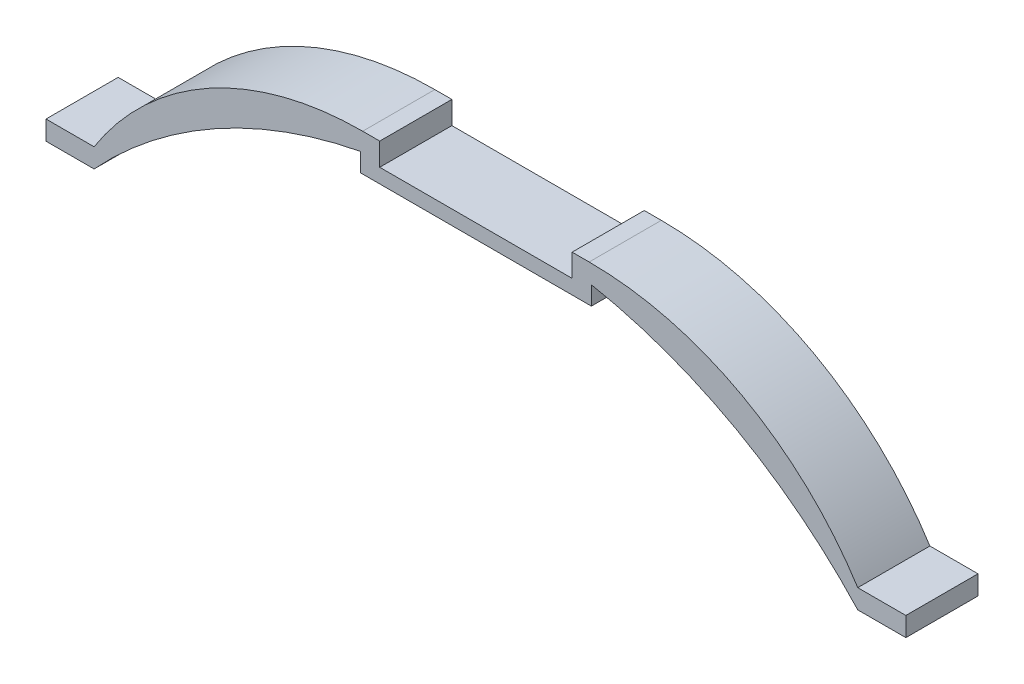
ISO-10303-21;
HEADER;
FILE_DESCRIPTION(('STEP AP214'),'2;1');
FILE_NAME('part.step','',(''),(''),'','','');
FILE_SCHEMA(('AUTOMOTIVE_DESIGN { 1 0 10303 214 1 1 1 1 }'));
ENDSEC;
DATA;
#1=APPLICATION_CONTEXT('core data for automotive mechanical design processes');
#2=APPLICATION_PROTOCOL_DEFINITION('international standard','automotive_design',2000,#1);
#3=PRODUCT_CONTEXT('',#1,'mechanical');
#4=PRODUCT('Part','Part','',(#3));
#5=PRODUCT_RELATED_PRODUCT_CATEGORY('part','',(#4));
#6=PRODUCT_DEFINITION_FORMATION('','',#4);
#7=PRODUCT_DEFINITION_CONTEXT('part definition',#1,'design');
#8=PRODUCT_DEFINITION('design','',#6,#7);
#9=PRODUCT_DEFINITION_SHAPE('','',#8);
#10=(LENGTH_UNIT() NAMED_UNIT(*) SI_UNIT(.MILLI.,.METRE.));
#11=(NAMED_UNIT(*) PLANE_ANGLE_UNIT() SI_UNIT($,.RADIAN.));
#12=(NAMED_UNIT(*) SI_UNIT($,.STERADIAN.) SOLID_ANGLE_UNIT());
#13=UNCERTAINTY_MEASURE_WITH_UNIT(LENGTH_MEASURE(1.E-05),#10,'distance_accuracy_value','');
#14=(GEOMETRIC_REPRESENTATION_CONTEXT(3) GLOBAL_UNCERTAINTY_ASSIGNED_CONTEXT((#13)) GLOBAL_UNIT_ASSIGNED_CONTEXT((#10,
#11,#12)) REPRESENTATION_CONTEXT('',''));
#15=CARTESIAN_POINT('',(0.,0.,0.));
#16=DIRECTION('',(0.,0.,1.));
#17=DIRECTION('',(1.,0.,0.));
#18=AXIS2_PLACEMENT_3D('',#15,#16,#17);
#19=CARTESIAN_POINT('',(-89.3822623858752,-30.8591549295775,15.));
#20=DIRECTION('',(-1.,0.,0.));
#21=DIRECTION('',(0.,0.,1.));
#22=AXIS2_PLACEMENT_3D('',#19,#20,#21);
#23=PLANE('',#22);
#24=DIRECTION('',(0.,1.,0.));
#25=VECTOR('',#24,1.);
#26=CARTESIAN_POINT('',(-89.3822623858752,-30.8591549295775,0.));
#27=LINE('',#26,#25);
#28=CARTESIAN_POINT('',(-89.3822623858752,-30.8591549295775,0.));
#29=VERTEX_POINT('',#28);
#30=CARTESIAN_POINT('',(-89.3822623858752,-26.8591549295775,0.));
#31=VERTEX_POINT('',#30);
#32=EDGE_CURVE('E189',#29,#31,#27,.T.);
#33=ORIENTED_EDGE('',*,*,#32,.F.);
#34=DIRECTION('',(0.,0.,-1.));
#35=VECTOR('',#34,1.);
#36=CARTESIAN_POINT('',(-89.3822623858752,-30.8591549295775,15.));
#37=LINE('',#36,#35);
#38=CARTESIAN_POINT('',(-89.3822623858752,-30.8591549295775,15.));
#39=VERTEX_POINT('',#38);
#40=EDGE_CURVE('E11',#39,#29,#37,.T.);
#41=ORIENTED_EDGE('',*,*,#40,.F.);
#42=DIRECTION('',(0.,1.,0.));
#43=VECTOR('',#42,1.);
#44=CARTESIAN_POINT('',(-89.3822623858752,-30.8591549295775,15.));
#45=LINE('',#44,#43);
#46=CARTESIAN_POINT('',(-89.3822623858752,-26.8591549295775,15.));
#47=VERTEX_POINT('',#46);
#48=EDGE_CURVE('E234',#39,#47,#45,.T.);
#49=ORIENTED_EDGE('',*,*,#48,.T.);
#50=DIRECTION('',(0.,0.,-1.));
#51=VECTOR('',#50,1.);
#52=CARTESIAN_POINT('',(-89.3822623858752,-26.8591549295775,15.));
#53=LINE('',#52,#51);
#54=EDGE_CURVE('E36',#47,#31,#53,.T.);
#55=ORIENTED_EDGE('',*,*,#54,.T.);
#56=EDGE_LOOP('',(#33,#41,#49,#55));
#57=FACE_BOUND('',#56,.T.);
#58=ADVANCED_FACE('F33',(#57),#23,.T.);
#59=CARTESIAN_POINT('',(-89.3822623858752,-30.8591549295775,15.));
#60=DIRECTION('',(0.,1.,0.));
#61=DIRECTION('',(0.,0.,1.));
#62=AXIS2_PLACEMENT_3D('',#59,#60,#61);
#63=PLANE('',#62);
#64=DIRECTION('',(1.,0.,0.));
#65=VECTOR('',#64,1.);
#66=CARTESIAN_POINT('',(-89.3822623858752,-30.8591549295775,0.));
#67=LINE('',#66,#65);
#68=CARTESIAN_POINT('',(-79.3822623858752,-30.8591549295775,0.));
#69=VERTEX_POINT('',#68);
#70=EDGE_CURVE('E233',#29,#69,#67,.T.);
#71=ORIENTED_EDGE('',*,*,#70,.T.);
#72=DIRECTION('',(0.,0.,-1.));
#73=VECTOR('',#72,1.);
#74=CARTESIAN_POINT('',(-79.3822623858752,-30.8591549295775,15.));
#75=LINE('',#74,#73);
#76=CARTESIAN_POINT('',(-79.3822623858752,-30.8591549295775,15.));
#77=VERTEX_POINT('',#76);
#78=EDGE_CURVE('E42',#77,#69,#75,.T.);
#79=ORIENTED_EDGE('',*,*,#78,.F.);
#80=DIRECTION('',(1.,0.,0.));
#81=VECTOR('',#80,1.);
#82=CARTESIAN_POINT('',(-89.3822623858752,-30.8591549295775,15.));
#83=LINE('',#82,#81);
#84=EDGE_CURVE('E178',#39,#77,#83,.T.);
#85=ORIENTED_EDGE('',*,*,#84,.F.);
#86=ORIENTED_EDGE('',*,*,#40,.T.);
#87=EDGE_LOOP('',(#71,#79,#85,#86));
#88=FACE_BOUND('',#87,.T.);
#89=ADVANCED_FACE('F273',(#88),#63,.F.);
#90=CARTESIAN_POINT('',(-4.83274795330094,-99.5253111774484,15.));
#91=DIRECTION('',(0.,0.,-1.));
#92=DIRECTION('',(-1.,0.,0.));
#93=AXIS2_PLACEMENT_3D('',#90,#91,#92);
#94=CYLINDRICAL_SURFACE('',#93,101.354186474904);
#95=CARTESIAN_POINT('',(-4.83274795330094,-99.5253111774484,0.));
#96=DIRECTION('',(0.,0.,1.));
#97=DIRECTION('',(1.,0.,0.));
#98=AXIS2_PLACEMENT_3D('',#95,#96,#97);
#99=CIRCLE('',#98,101.354186474904);
#100=CARTESIAN_POINT('',(-24.,0.,0.));
#101=VERTEX_POINT('',#100);
#102=EDGE_CURVE('E168',#101,#69,#99,.T.);
#103=ORIENTED_EDGE('',*,*,#102,.F.);
#104=DIRECTION('',(0.,0.,-1.));
#105=VECTOR('',#104,1.);
#106=CARTESIAN_POINT('',(-24.,0.,15.));
#107=LINE('',#106,#105);
#108=CARTESIAN_POINT('',(-24.,0.,15.));
#109=VERTEX_POINT('',#108);
#110=EDGE_CURVE('E163',#109,#101,#107,.T.);
#111=ORIENTED_EDGE('',*,*,#110,.F.);
#112=CARTESIAN_POINT('',(-4.83274795330094,-99.5253111774484,15.));
#113=DIRECTION('',(0.,0.,1.));
#114=DIRECTION('',(1.,0.,0.));
#115=AXIS2_PLACEMENT_3D('',#112,#113,#114);
#116=CIRCLE('',#115,101.354186474904);
#117=EDGE_CURVE('E166',#109,#77,#116,.T.);
#118=ORIENTED_EDGE('',*,*,#117,.T.);
#119=ORIENTED_EDGE('',*,*,#78,.T.);
#120=EDGE_LOOP('',(#103,#111,#118,#119));
#121=FACE_BOUND('',#120,.T.);
#122=ADVANCED_FACE('F165',(#121),#94,.F.);
#123=CARTESIAN_POINT('',(-24.,-3.85915492957747,15.));
#124=DIRECTION('',(-1.,0.,0.));
#125=DIRECTION('',(0.,0.,1.));
#126=AXIS2_PLACEMENT_3D('',#123,#124,#125);
#127=PLANE('',#126);
#128=DIRECTION('',(0.,1.,0.));
#129=VECTOR('',#128,1.);
#130=CARTESIAN_POINT('',(-24.,-3.85915492957747,0.));
#131=LINE('',#130,#129);
#132=CARTESIAN_POINT('',(-24.,-3.85915492957747,0.));
#133=VERTEX_POINT('',#132);
#134=EDGE_CURVE('E230',#133,#101,#131,.T.);
#135=ORIENTED_EDGE('',*,*,#134,.F.);
#136=DIRECTION('',(0.,0.,-1.));
#137=VECTOR('',#136,1.);
#138=CARTESIAN_POINT('',(-24.,-3.85915492957747,15.));
#139=LINE('',#138,#137);
#140=CARTESIAN_POINT('',(-24.,-3.85915492957747,15.));
#141=VERTEX_POINT('',#140);
#142=EDGE_CURVE('E173',#141,#133,#139,.T.);
#143=ORIENTED_EDGE('',*,*,#142,.F.);
#144=DIRECTION('',(0.,1.,0.));
#145=VECTOR('',#144,1.);
#146=CARTESIAN_POINT('',(-24.,-3.85915492957747,15.));
#147=LINE('',#146,#145);
#148=EDGE_CURVE('E177',#141,#109,#147,.T.);
#149=ORIENTED_EDGE('',*,*,#148,.T.);
#150=ORIENTED_EDGE('',*,*,#110,.T.);
#151=EDGE_LOOP('',(#135,#143,#149,#150));
#152=FACE_BOUND('',#151,.T.);
#153=ADVANCED_FACE('F180',(#152),#127,.T.);
#154=CARTESIAN_POINT('',(-24.,-3.85915492957747,15.));
#155=DIRECTION('',(0.,1.,0.));
#156=DIRECTION('',(-1.,0.,0.));
#157=AXIS2_PLACEMENT_3D('',#154,#155,#156);
#158=PLANE('',#157);
#159=DIRECTION('',(1.,0.,0.));
#160=VECTOR('',#159,1.);
#161=CARTESIAN_POINT('',(-24.,-3.85915492957747,0.));
#162=LINE('',#161,#160);
#163=CARTESIAN_POINT('',(24.,-3.85915492957747,0.));
#164=VERTEX_POINT('',#163);
#165=EDGE_CURVE('E228',#133,#164,#162,.T.);
#166=ORIENTED_EDGE('',*,*,#165,.T.);
#167=DIRECTION('',(0.,0.,-1.));
#168=VECTOR('',#167,1.);
#169=CARTESIAN_POINT('',(24.,-3.85915492957747,15.));
#170=LINE('',#169,#168);
#171=CARTESIAN_POINT('',(24.,-3.85915492957747,15.));
#172=VERTEX_POINT('',#171);
#173=EDGE_CURVE('E238',#172,#164,#170,.T.);
#174=ORIENTED_EDGE('',*,*,#173,.F.);
#175=DIRECTION('',(1.,0.,0.));
#176=VECTOR('',#175,1.);
#177=CARTESIAN_POINT('',(-24.,-3.85915492957747,15.));
#178=LINE('',#177,#176);
#179=EDGE_CURVE('E182',#141,#172,#178,.T.);
#180=ORIENTED_EDGE('',*,*,#179,.F.);
#181=ORIENTED_EDGE('',*,*,#142,.T.);
#182=EDGE_LOOP('',(#166,#174,#180,#181));
#183=FACE_BOUND('',#182,.T.);
#184=ADVANCED_FACE('F359',(#183),#158,.F.);
#185=CARTESIAN_POINT('',(24.,-3.85915492957747,15.));
#186=DIRECTION('',(-1.,0.,0.));
#187=DIRECTION('',(0.,0.,1.));
#188=AXIS2_PLACEMENT_3D('',#185,#186,#187);
#189=PLANE('',#188);
#190=DIRECTION('',(0.,1.,0.));
#191=VECTOR('',#190,1.);
#192=CARTESIAN_POINT('',(24.,-3.85915492957747,0.));
#193=LINE('',#192,#191);
#194=CARTESIAN_POINT('',(24.,0.,0.));
#195=VERTEX_POINT('',#194);
#196=EDGE_CURVE('E226',#164,#195,#193,.T.);
#197=ORIENTED_EDGE('',*,*,#196,.T.);
#198=DIRECTION('',(0.,0.,-1.));
#199=VECTOR('',#198,1.);
#200=CARTESIAN_POINT('',(24.,0.,15.));
#201=LINE('',#200,#199);
#202=CARTESIAN_POINT('',(24.,0.,15.));
#203=VERTEX_POINT('',#202);
#204=EDGE_CURVE('E241',#203,#195,#201,.T.);
#205=ORIENTED_EDGE('',*,*,#204,.F.);
#206=DIRECTION('',(0.,1.,0.));
#207=VECTOR('',#206,1.);
#208=CARTESIAN_POINT('',(24.,-3.85915492957747,15.));
#209=LINE('',#208,#207);
#210=EDGE_CURVE('E184',#172,#203,#209,.T.);
#211=ORIENTED_EDGE('',*,*,#210,.F.);
#212=ORIENTED_EDGE('',*,*,#173,.T.);
#213=EDGE_LOOP('',(#197,#205,#211,#212));
#214=FACE_BOUND('',#213,.T.);
#215=ADVANCED_FACE('F311',(#214),#189,.F.);
#216=CARTESIAN_POINT('',(4.83274795330094,-99.5253111774484,15.));
#217=DIRECTION('',(0.,0.,-1.));
#218=DIRECTION('',(-1.,0.,0.));
#219=AXIS2_PLACEMENT_3D('',#216,#217,#218);
#220=CYLINDRICAL_SURFACE('',#219,101.354186474904);
#221=CARTESIAN_POINT('',(4.83274795330094,-99.5253111774484,0.));
#222=DIRECTION('',(0.,0.,-1.));
#223=DIRECTION('',(-1.,0.,0.));
#224=AXIS2_PLACEMENT_3D('',#221,#222,#223);
#225=CIRCLE('',#224,101.354186474904);
#226=CARTESIAN_POINT('',(79.3822623858752,-30.8591549295775,0.));
#227=VERTEX_POINT('',#226);
#228=EDGE_CURVE('E223',#195,#227,#225,.T.);
#229=ORIENTED_EDGE('',*,*,#228,.T.);
#230=DIRECTION('',(0.,0.,-1.));
#231=VECTOR('',#230,1.);
#232=CARTESIAN_POINT('',(79.3822623858752,-30.8591549295775,15.));
#233=LINE('',#232,#231);
#234=CARTESIAN_POINT('',(79.3822623858752,-30.8591549295775,15.));
#235=VERTEX_POINT('',#234);
#236=EDGE_CURVE('E244',#235,#227,#233,.T.);
#237=ORIENTED_EDGE('',*,*,#236,.F.);
#238=CARTESIAN_POINT('',(4.83274795330094,-99.5253111774484,15.));
#239=DIRECTION('',(0.,0.,-1.));
#240=DIRECTION('',(-1.,0.,0.));
#241=AXIS2_PLACEMENT_3D('',#238,#239,#240);
#242=CIRCLE('',#241,101.354186474904);
#243=EDGE_CURVE('E303',#203,#235,#242,.T.);
#244=ORIENTED_EDGE('',*,*,#243,.F.);
#245=ORIENTED_EDGE('',*,*,#204,.T.);
#246=EDGE_LOOP('',(#229,#237,#244,#245));
#247=FACE_BOUND('',#246,.T.);
#248=ADVANCED_FACE('F315',(#247),#220,.F.);
#249=CARTESIAN_POINT('',(89.3822623858752,-30.8591549295775,15.));
#250=DIRECTION('',(0.,-1.,0.));
#251=DIRECTION('',(0.,0.,-1.));
#252=AXIS2_PLACEMENT_3D('',#249,#250,#251);
#253=PLANE('',#252);
#254=DIRECTION('',(-1.,0.,0.));
#255=VECTOR('',#254,1.);
#256=CARTESIAN_POINT('',(89.3822623858752,-30.8591549295775,0.));
#257=LINE('',#256,#255);
#258=CARTESIAN_POINT('',(89.3822623858752,-30.8591549295775,0.));
#259=VERTEX_POINT('',#258);
#260=EDGE_CURVE('E220',#259,#227,#257,.T.);
#261=ORIENTED_EDGE('',*,*,#260,.F.);
#262=DIRECTION('',(0.,0.,-1.));
#263=VECTOR('',#262,1.);
#264=CARTESIAN_POINT('',(89.3822623858752,-30.8591549295775,15.));
#265=LINE('',#264,#263);
#266=CARTESIAN_POINT('',(89.3822623858752,-30.8591549295775,15.));
#267=VERTEX_POINT('',#266);
#268=EDGE_CURVE('E246',#267,#259,#265,.T.);
#269=ORIENTED_EDGE('',*,*,#268,.F.);
#270=DIRECTION('',(-1.,0.,0.));
#271=VECTOR('',#270,1.);
#272=CARTESIAN_POINT('',(89.3822623858752,-30.8591549295775,15.));
#273=LINE('',#272,#271);
#274=EDGE_CURVE('E300',#267,#235,#273,.T.);
#275=ORIENTED_EDGE('',*,*,#274,.T.);
#276=ORIENTED_EDGE('',*,*,#236,.T.);
#277=EDGE_LOOP('',(#261,#269,#275,#276));
#278=FACE_BOUND('',#277,.T.);
#279=ADVANCED_FACE('F318',(#278),#253,.T.);
#280=CARTESIAN_POINT('',(89.3822623858752,-30.8591549295775,15.));
#281=DIRECTION('',(-1.,0.,0.));
#282=DIRECTION('',(0.,0.,1.));
#283=AXIS2_PLACEMENT_3D('',#280,#281,#282);
#284=PLANE('',#283);
#285=DIRECTION('',(0.,1.,0.));
#286=VECTOR('',#285,1.);
#287=CARTESIAN_POINT('',(89.3822623858752,-30.8591549295775,0.));
#288=LINE('',#287,#286);
#289=CARTESIAN_POINT('',(89.3822623858752,-26.8591549295775,0.));
#290=VERTEX_POINT('',#289);
#291=EDGE_CURVE('E217',#259,#290,#288,.T.);
#292=ORIENTED_EDGE('',*,*,#291,.T.);
#293=DIRECTION('',(0.,0.,-1.));
#294=VECTOR('',#293,1.);
#295=CARTESIAN_POINT('',(89.3822623858752,-26.8591549295775,15.));
#296=LINE('',#295,#294);
#297=CARTESIAN_POINT('',(89.3822623858752,-26.8591549295775,15.));
#298=VERTEX_POINT('',#297);
#299=EDGE_CURVE('E248',#298,#290,#296,.T.);
#300=ORIENTED_EDGE('',*,*,#299,.F.);
#301=DIRECTION('',(0.,1.,0.));
#302=VECTOR('',#301,1.);
#303=CARTESIAN_POINT('',(89.3822623858752,-30.8591549295775,15.));
#304=LINE('',#303,#302);
#305=EDGE_CURVE('E298',#267,#298,#304,.T.);
#306=ORIENTED_EDGE('',*,*,#305,.F.);
#307=ORIENTED_EDGE('',*,*,#268,.T.);
#308=EDGE_LOOP('',(#292,#300,#306,#307));
#309=FACE_BOUND('',#308,.T.);
#310=ADVANCED_FACE('F324',(#309),#284,.F.);
#311=CARTESIAN_POINT('',(79.3822623858752,-26.8591549295775,15.));
#312=DIRECTION('',(0.,1.,0.));
#313=DIRECTION('',(0.,0.,1.));
#314=AXIS2_PLACEMENT_3D('',#311,#312,#313);
#315=PLANE('',#314);
#316=DIRECTION('',(1.,0.,0.));
#317=VECTOR('',#316,1.);
#318=CARTESIAN_POINT('',(79.3822623858752,-26.8591549295775,0.));
#319=LINE('',#318,#317);
#320=CARTESIAN_POINT('',(79.3822623858752,-26.8591549295775,0.));
#321=VERTEX_POINT('',#320);
#322=EDGE_CURVE('E214',#321,#290,#319,.T.);
#323=ORIENTED_EDGE('',*,*,#322,.F.);
#324=DIRECTION('',(0.,0.,-1.));
#325=VECTOR('',#324,1.);
#326=CARTESIAN_POINT('',(79.3822623858752,-26.8591549295775,15.));
#327=LINE('',#326,#325);
#328=CARTESIAN_POINT('',(79.3822623858752,-26.8591549295775,15.));
#329=VERTEX_POINT('',#328);
#330=EDGE_CURVE('E250',#329,#321,#327,.T.);
#331=ORIENTED_EDGE('',*,*,#330,.F.);
#332=DIRECTION('',(1.,0.,0.));
#333=VECTOR('',#332,1.);
#334=CARTESIAN_POINT('',(79.3822623858752,-26.8591549295775,15.));
#335=LINE('',#334,#333);
#336=EDGE_CURVE('E295',#329,#298,#335,.T.);
#337=ORIENTED_EDGE('',*,*,#336,.T.);
#338=ORIENTED_EDGE('',*,*,#299,.T.);
#339=EDGE_LOOP('',(#323,#331,#337,#338));
#340=FACE_BOUND('',#339,.T.);
#341=ADVANCED_FACE('F328',(#340),#315,.T.);
#342=CARTESIAN_POINT('',(23.5438051659571,-62.248547148553,15.));
#343=DIRECTION('',(0.,0.,-1.));
#344=DIRECTION('',(-1.,0.,0.));
#345=AXIS2_PLACEMENT_3D('',#342,#343,#344);
#346=CYLINDRICAL_SURFACE('',#345,66.1085651510385);
#347=CARTESIAN_POINT('',(23.5438051659571,-62.248547148553,0.));
#348=DIRECTION('',(0.,0.,-1.));
#349=DIRECTION('',(-1.,0.,0.));
#350=AXIS2_PLACEMENT_3D('',#347,#348,#349);
#351=CIRCLE('',#350,66.1085651510385);
#352=CARTESIAN_POINT('',(23.5438051659571,3.86001800248553,0.));
#353=VERTEX_POINT('',#352);
#354=EDGE_CURVE('E211',#353,#321,#351,.T.);
#355=ORIENTED_EDGE('',*,*,#354,.F.);
#356=DIRECTION('',(0.,0.,-1.));
#357=VECTOR('',#356,1.);
#358=CARTESIAN_POINT('',(23.5438051659571,3.86001800248553,15.));
#359=LINE('',#358,#357);
#360=CARTESIAN_POINT('',(23.5438051659571,3.86001800248553,15.));
#361=VERTEX_POINT('',#360);
#362=EDGE_CURVE('E252',#361,#353,#359,.T.);
#363=ORIENTED_EDGE('',*,*,#362,.F.);
#364=CARTESIAN_POINT('',(23.5438051659571,-62.248547148553,15.));
#365=DIRECTION('',(0.,0.,-1.));
#366=DIRECTION('',(-1.,0.,0.));
#367=AXIS2_PLACEMENT_3D('',#364,#365,#366);
#368=CIRCLE('',#367,66.1085651510385);
#369=EDGE_CURVE('E292',#361,#329,#368,.T.);
#370=ORIENTED_EDGE('',*,*,#369,.T.);
#371=ORIENTED_EDGE('',*,*,#330,.T.);
#372=EDGE_LOOP('',(#355,#363,#370,#371));
#373=FACE_BOUND('',#372,.T.);
#374=ADVANCED_FACE('F331',(#373),#346,.T.);
#375=CARTESIAN_POINT('',(20.,3.86001800248552,15.));
#376=DIRECTION('',(0.,1.,0.));
#377=DIRECTION('',(-1.,0.,0.));
#378=AXIS2_PLACEMENT_3D('',#375,#376,#377);
#379=PLANE('',#378);
#380=DIRECTION('',(1.,0.,0.));
#381=VECTOR('',#380,1.);
#382=CARTESIAN_POINT('',(20.,3.86001800248552,0.));
#383=LINE('',#382,#381);
#384=CARTESIAN_POINT('',(20.,3.86001800248552,0.));
#385=VERTEX_POINT('',#384);
#386=EDGE_CURVE('E208',#385,#353,#383,.T.);
#387=ORIENTED_EDGE('',*,*,#386,.F.);
#388=DIRECTION('',(0.,0.,-1.));
#389=VECTOR('',#388,1.);
#390=CARTESIAN_POINT('',(20.,3.86001800248552,15.));
#391=LINE('',#390,#389);
#392=CARTESIAN_POINT('',(20.,3.86001800248552,15.));
#393=VERTEX_POINT('',#392);
#394=EDGE_CURVE('E254',#393,#385,#391,.T.);
#395=ORIENTED_EDGE('',*,*,#394,.F.);
#396=DIRECTION('',(1.,0.,0.));
#397=VECTOR('',#396,1.);
#398=CARTESIAN_POINT('',(20.,3.86001800248552,15.));
#399=LINE('',#398,#397);
#400=EDGE_CURVE('E289',#393,#361,#399,.T.);
#401=ORIENTED_EDGE('',*,*,#400,.T.);
#402=ORIENTED_EDGE('',*,*,#362,.T.);
#403=EDGE_LOOP('',(#387,#395,#401,#402));
#404=FACE_BOUND('',#403,.T.);
#405=ADVANCED_FACE('F336',(#404),#379,.T.);
#406=CARTESIAN_POINT('',(20.,-0.85915492957747,15.));
#407=DIRECTION('',(-1.,0.,0.));
#408=DIRECTION('',(0.,-1.,0.));
#409=AXIS2_PLACEMENT_3D('',#406,#407,#408);
#410=PLANE('',#409);
#411=DIRECTION('',(0.,1.,0.));
#412=VECTOR('',#411,1.);
#413=CARTESIAN_POINT('',(20.,-0.85915492957747,0.));
#414=LINE('',#413,#412);
#415=CARTESIAN_POINT('',(20.,-0.85915492957747,0.));
#416=VERTEX_POINT('',#415);
#417=EDGE_CURVE('E205',#416,#385,#414,.T.);
#418=ORIENTED_EDGE('',*,*,#417,.F.);
#419=DIRECTION('',(0.,0.,-1.));
#420=VECTOR('',#419,1.);
#421=CARTESIAN_POINT('',(20.,-0.85915492957747,15.));
#422=LINE('',#421,#420);
#423=CARTESIAN_POINT('',(20.,-0.85915492957747,15.));
#424=VERTEX_POINT('',#423);
#425=EDGE_CURVE('E256',#424,#416,#422,.T.);
#426=ORIENTED_EDGE('',*,*,#425,.F.);
#427=DIRECTION('',(0.,1.,0.));
#428=VECTOR('',#427,1.);
#429=CARTESIAN_POINT('',(20.,-0.85915492957747,15.));
#430=LINE('',#429,#428);
#431=EDGE_CURVE('E286',#424,#393,#430,.T.);
#432=ORIENTED_EDGE('',*,*,#431,.T.);
#433=ORIENTED_EDGE('',*,*,#394,.T.);
#434=EDGE_LOOP('',(#418,#426,#432,#433));
#435=FACE_BOUND('',#434,.T.);
#436=ADVANCED_FACE('F339',(#435),#410,.T.);
#437=CARTESIAN_POINT('',(20.,-0.85915492957747,15.));
#438=DIRECTION('',(0.,-1.,0.));
#439=DIRECTION('',(1.,0.,0.));
#440=AXIS2_PLACEMENT_3D('',#437,#438,#439);
#441=PLANE('',#440);
#442=DIRECTION('',(-1.,0.,0.));
#443=VECTOR('',#442,1.);
#444=CARTESIAN_POINT('',(20.,-0.85915492957747,0.));
#445=LINE('',#444,#443);
#446=CARTESIAN_POINT('',(-20.,-0.859154929577474,0.));
#447=VERTEX_POINT('',#446);
#448=EDGE_CURVE('E203',#416,#447,#445,.T.);
#449=ORIENTED_EDGE('',*,*,#448,.T.);
#450=DIRECTION('',(0.,0.,-1.));
#451=VECTOR('',#450,1.);
#452=CARTESIAN_POINT('',(-20.,-0.859154929577474,15.));
#453=LINE('',#452,#451);
#454=CARTESIAN_POINT('',(-20.,-0.859154929577474,15.));
#455=VERTEX_POINT('',#454);
#456=EDGE_CURVE('E258',#455,#447,#453,.T.);
#457=ORIENTED_EDGE('',*,*,#456,.F.);
#458=DIRECTION('',(-1.,0.,0.));
#459=VECTOR('',#458,1.);
#460=CARTESIAN_POINT('',(20.,-0.85915492957747,15.));
#461=LINE('',#460,#459);
#462=EDGE_CURVE('E284',#424,#455,#461,.T.);
#463=ORIENTED_EDGE('',*,*,#462,.F.);
#464=ORIENTED_EDGE('',*,*,#425,.T.);
#465=EDGE_LOOP('',(#449,#457,#463,#464));
#466=FACE_BOUND('',#465,.T.);
#467=ADVANCED_FACE('F346',(#466),#441,.F.);
#468=CARTESIAN_POINT('',(-20.,-0.859154929577474,15.));
#469=DIRECTION('',(-1.,0.,0.));
#470=DIRECTION('',(0.,-1.,0.));
#471=AXIS2_PLACEMENT_3D('',#468,#469,#470);
#472=PLANE('',#471);
#473=DIRECTION('',(0.,1.,0.));
#474=VECTOR('',#473,1.);
#475=CARTESIAN_POINT('',(-20.,-0.859154929577474,0.));
#476=LINE('',#475,#474);
#477=CARTESIAN_POINT('',(-20.,3.86001800248552,0.));
#478=VERTEX_POINT('',#477);
#479=EDGE_CURVE('E200',#447,#478,#476,.T.);
#480=ORIENTED_EDGE('',*,*,#479,.T.);
#481=DIRECTION('',(0.,0.,-1.));
#482=VECTOR('',#481,1.);
#483=CARTESIAN_POINT('',(-20.,3.86001800248552,15.));
#484=LINE('',#483,#482);
#485=CARTESIAN_POINT('',(-20.,3.86001800248552,15.));
#486=VERTEX_POINT('',#485);
#487=EDGE_CURVE('E261',#486,#478,#484,.T.);
#488=ORIENTED_EDGE('',*,*,#487,.F.);
#489=DIRECTION('',(0.,1.,0.));
#490=VECTOR('',#489,1.);
#491=CARTESIAN_POINT('',(-20.,-0.859154929577474,15.));
#492=LINE('',#491,#490);
#493=EDGE_CURVE('E282',#455,#486,#492,.T.);
#494=ORIENTED_EDGE('',*,*,#493,.F.);
#495=ORIENTED_EDGE('',*,*,#456,.T.);
#496=EDGE_LOOP('',(#480,#488,#494,#495));
#497=FACE_BOUND('',#496,.T.);
#498=ADVANCED_FACE('F350',(#497),#472,.F.);
#499=CARTESIAN_POINT('',(-23.5438051659571,3.86001800248552,15.));
#500=DIRECTION('',(0.,1.,0.));
#501=DIRECTION('',(-1.,0.,0.));
#502=AXIS2_PLACEMENT_3D('',#499,#500,#501);
#503=PLANE('',#502);
#504=DIRECTION('',(1.,0.,0.));
#505=VECTOR('',#504,1.);
#506=CARTESIAN_POINT('',(-23.5438051659571,3.86001800248552,0.));
#507=LINE('',#506,#505);
#508=CARTESIAN_POINT('',(-23.5438051659571,3.86001800248552,0.));
#509=VERTEX_POINT('',#508);
#510=EDGE_CURVE('E197',#509,#478,#507,.T.);
#511=ORIENTED_EDGE('',*,*,#510,.F.);
#512=DIRECTION('',(0.,0.,-1.));
#513=VECTOR('',#512,1.);
#514=CARTESIAN_POINT('',(-23.5438051659571,3.86001800248552,15.));
#515=LINE('',#514,#513);
#516=CARTESIAN_POINT('',(-23.5438051659571,3.86001800248552,15.));
#517=VERTEX_POINT('',#516);
#518=EDGE_CURVE('E263',#517,#509,#515,.T.);
#519=ORIENTED_EDGE('',*,*,#518,.F.);
#520=DIRECTION('',(1.,0.,0.));
#521=VECTOR('',#520,1.);
#522=CARTESIAN_POINT('',(-23.5438051659571,3.86001800248552,15.));
#523=LINE('',#522,#521);
#524=EDGE_CURVE('E279',#517,#486,#523,.T.);
#525=ORIENTED_EDGE('',*,*,#524,.T.);
#526=ORIENTED_EDGE('',*,*,#487,.T.);
#527=EDGE_LOOP('',(#511,#519,#525,#526));
#528=FACE_BOUND('',#527,.T.);
#529=ADVANCED_FACE('F353',(#528),#503,.T.);
#530=CARTESIAN_POINT('',(-23.5438051659571,-62.248547148553,15.));
#531=DIRECTION('',(0.,0.,-1.));
#532=DIRECTION('',(-1.,0.,0.));
#533=AXIS2_PLACEMENT_3D('',#530,#531,#532);
#534=CYLINDRICAL_SURFACE('',#533,66.1085651510385);
#535=CARTESIAN_POINT('',(-23.5438051659571,-62.248547148553,0.));
#536=DIRECTION('',(0.,0.,1.));
#537=DIRECTION('',(1.,0.,0.));
#538=AXIS2_PLACEMENT_3D('',#535,#536,#537);
#539=CIRCLE('',#538,66.1085651510385);
#540=CARTESIAN_POINT('',(-79.3822623858752,-26.8591549295775,0.));
#541=VERTEX_POINT('',#540);
#542=EDGE_CURVE('E195',#509,#541,#539,.T.);
#543=ORIENTED_EDGE('',*,*,#542,.T.);
#544=DIRECTION('',(0.,0.,-1.));
#545=VECTOR('',#544,1.);
#546=CARTESIAN_POINT('',(-79.3822623858752,-26.8591549295775,15.));
#547=LINE('',#546,#545);
#548=CARTESIAN_POINT('',(-79.3822623858752,-26.8591549295775,15.));
#549=VERTEX_POINT('',#548);
#550=EDGE_CURVE('E264',#549,#541,#547,.T.);
#551=ORIENTED_EDGE('',*,*,#550,.F.);
#552=CARTESIAN_POINT('',(-23.5438051659571,-62.248547148553,15.));
#553=DIRECTION('',(0.,0.,1.));
#554=DIRECTION('',(1.,0.,0.));
#555=AXIS2_PLACEMENT_3D('',#552,#553,#554);
#556=CIRCLE('',#555,66.1085651510385);
#557=EDGE_CURVE('E275',#517,#549,#556,.T.);
#558=ORIENTED_EDGE('',*,*,#557,.F.);
#559=ORIENTED_EDGE('',*,*,#518,.T.);
#560=EDGE_LOOP('',(#543,#551,#558,#559));
#561=FACE_BOUND('',#560,.T.);
#562=ADVANCED_FACE('F356',(#561),#534,.T.);
#563=CARTESIAN_POINT('',(-79.3822623858752,-26.8591549295775,15.));
#564=DIRECTION('',(0.,-1.,0.));
#565=DIRECTION('',(0.,0.,-1.));
#566=AXIS2_PLACEMENT_3D('',#563,#564,#565);
#567=PLANE('',#566);
#568=DIRECTION('',(-1.,0.,0.));
#569=VECTOR('',#568,1.);
#570=CARTESIAN_POINT('',(-79.3822623858752,-26.8591549295775,0.));
#571=LINE('',#570,#569);
#572=EDGE_CURVE('E192',#541,#31,#571,.T.);
#573=ORIENTED_EDGE('',*,*,#572,.T.);
#574=ORIENTED_EDGE('',*,*,#54,.F.);
#575=DIRECTION('',(-1.,0.,0.));
#576=VECTOR('',#575,1.);
#577=CARTESIAN_POINT('',(-79.3822623858752,-26.8591549295775,15.));
#578=LINE('',#577,#576);
#579=EDGE_CURVE('E120',#549,#47,#578,.T.);
#580=ORIENTED_EDGE('',*,*,#579,.F.);
#581=ORIENTED_EDGE('',*,*,#550,.T.);
#582=EDGE_LOOP('',(#573,#574,#580,#581));
#583=FACE_BOUND('',#582,.T.);
#584=ADVANCED_FACE('F269',(#583),#567,.F.);
#585=CARTESIAN_POINT('',(-23.5438051659571,-62.248547148553,15.));
#586=DIRECTION('',(0.,0.,1.));
#587=DIRECTION('',(1.,0.,0.));
#588=AXIS2_PLACEMENT_3D('',#585,#586,#587);
#589=PLANE('',#588);
#590=ORIENTED_EDGE('',*,*,#48,.F.);
#591=ORIENTED_EDGE('',*,*,#84,.T.);
#592=ORIENTED_EDGE('',*,*,#117,.F.);
#593=ORIENTED_EDGE('',*,*,#148,.F.);
#594=ORIENTED_EDGE('',*,*,#179,.T.);
#595=ORIENTED_EDGE('',*,*,#210,.T.);
#596=ORIENTED_EDGE('',*,*,#243,.T.);
#597=ORIENTED_EDGE('',*,*,#274,.F.);
#598=ORIENTED_EDGE('',*,*,#305,.T.);
#599=ORIENTED_EDGE('',*,*,#336,.F.);
#600=ORIENTED_EDGE('',*,*,#369,.F.);
#601=ORIENTED_EDGE('',*,*,#400,.F.);
#602=ORIENTED_EDGE('',*,*,#431,.F.);
#603=ORIENTED_EDGE('',*,*,#462,.T.);
#604=ORIENTED_EDGE('',*,*,#493,.T.);
#605=ORIENTED_EDGE('',*,*,#524,.F.);
#606=ORIENTED_EDGE('',*,*,#557,.T.);
#607=ORIENTED_EDGE('',*,*,#579,.T.);
#608=EDGE_LOOP('',(#590,#591,#592,#593,#594,#595,#596,#597,#598,#599,#600,#601,#602,#603,#604,
#605,#606,#607));
#609=FACE_BOUND('',#608,.T.);
#610=ADVANCED_FACE('F176',(#609),#589,.T.);
#611=CARTESIAN_POINT('',(-23.5438051659571,-62.248547148553,0.));
#612=DIRECTION('',(0.,0.,1.));
#613=DIRECTION('',(1.,0.,0.));
#614=AXIS2_PLACEMENT_3D('',#611,#612,#613);
#615=PLANE('',#614);
#616=ORIENTED_EDGE('',*,*,#32,.T.);
#617=ORIENTED_EDGE('',*,*,#572,.F.);
#618=ORIENTED_EDGE('',*,*,#542,.F.);
#619=ORIENTED_EDGE('',*,*,#510,.T.);
#620=ORIENTED_EDGE('',*,*,#479,.F.);
#621=ORIENTED_EDGE('',*,*,#448,.F.);
#622=ORIENTED_EDGE('',*,*,#417,.T.);
#623=ORIENTED_EDGE('',*,*,#386,.T.);
#624=ORIENTED_EDGE('',*,*,#354,.T.);
#625=ORIENTED_EDGE('',*,*,#322,.T.);
#626=ORIENTED_EDGE('',*,*,#291,.F.);
#627=ORIENTED_EDGE('',*,*,#260,.T.);
#628=ORIENTED_EDGE('',*,*,#228,.F.);
#629=ORIENTED_EDGE('',*,*,#196,.F.);
#630=ORIENTED_EDGE('',*,*,#165,.F.);
#631=ORIENTED_EDGE('',*,*,#134,.T.);
#632=ORIENTED_EDGE('',*,*,#102,.T.);
#633=ORIENTED_EDGE('',*,*,#70,.F.);
#634=EDGE_LOOP('',(#616,#617,#618,#619,#620,#621,#622,#623,#624,#625,#626,#627,#628,#629,#630,
#631,#632,#633));
#635=FACE_BOUND('',#634,.T.);
#636=ADVANCED_FACE('F272',(#635),#615,.F.);
#637=CLOSED_SHELL('',(#58,#89,#122,#153,#184,#215,#248,#279,#310,#341,#374,#405,#436,#467,#498,
#529,#562,#584,#610,#636));
#638=MANIFOLD_SOLID_BREP('B2',#637);
#639=ADVANCED_BREP_SHAPE_REPRESENTATION('',(#18,#638),#14);
#640=SHAPE_DEFINITION_REPRESENTATION(#9,#639);
ENDSEC;
END-ISO-10303-21;
